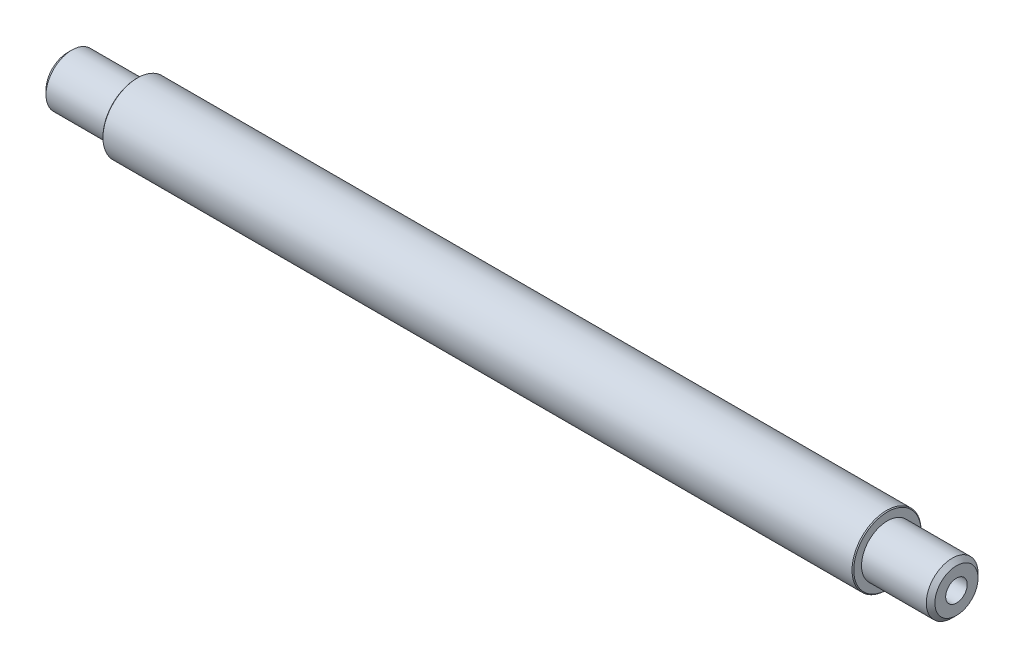
ISO-10303-21;
HEADER;
FILE_DESCRIPTION(('STEP AP214'),'2;1');
FILE_NAME('part.step','',(''),(''),'','','');
FILE_SCHEMA(('AUTOMOTIVE_DESIGN { 1 0 10303 214 1 1 1 1 }'));
ENDSEC;
DATA;
#1=APPLICATION_CONTEXT('core data for automotive mechanical design processes');
#2=APPLICATION_PROTOCOL_DEFINITION('international standard','automotive_design',2000,#1);
#3=PRODUCT_CONTEXT('',#1,'mechanical');
#4=PRODUCT('Part','Part','',(#3));
#5=PRODUCT_RELATED_PRODUCT_CATEGORY('part','',(#4));
#6=PRODUCT_DEFINITION_FORMATION('','',#4);
#7=PRODUCT_DEFINITION_CONTEXT('part definition',#1,'design');
#8=PRODUCT_DEFINITION('design','',#6,#7);
#9=PRODUCT_DEFINITION_SHAPE('','',#8);
#10=(LENGTH_UNIT() NAMED_UNIT(*) SI_UNIT(.MILLI.,.METRE.));
#11=(NAMED_UNIT(*) PLANE_ANGLE_UNIT() SI_UNIT($,.RADIAN.));
#12=(NAMED_UNIT(*) SI_UNIT($,.STERADIAN.) SOLID_ANGLE_UNIT());
#13=UNCERTAINTY_MEASURE_WITH_UNIT(LENGTH_MEASURE(1.E-05),#10,'distance_accuracy_value','');
#14=(GEOMETRIC_REPRESENTATION_CONTEXT(3) GLOBAL_UNCERTAINTY_ASSIGNED_CONTEXT((#13)) GLOBAL_UNIT_ASSIGNED_CONTEXT((#10,
#11,#12)) REPRESENTATION_CONTEXT('',''));
#15=CARTESIAN_POINT('',(0.,0.,0.));
#16=DIRECTION('',(0.,0.,1.));
#17=DIRECTION('',(1.,0.,0.));
#18=AXIS2_PLACEMENT_3D('',#15,#16,#17);
#19=CARTESIAN_POINT('',(-43.5,3.99999999999999,0.));
#20=DIRECTION('',(1.,0.,0.));
#21=DIRECTION('',(0.,0.,-1.));
#22=AXIS2_PLACEMENT_3D('',#19,#20,#21);
#23=PLANE('',#22);
#24=CARTESIAN_POINT('',(-43.5,0.,0.));
#25=DIRECTION('',(1.,0.,0.));
#26=DIRECTION('',(0.,0.,-1.));
#27=AXIS2_PLACEMENT_3D('',#24,#25,#26);
#28=CIRCLE('',#27,3.9);
#29=CARTESIAN_POINT('',(-43.5,0.,-3.9));
#30=VERTEX_POINT('',#29);
#31=EDGE_CURVE('E11',#30,#30,#28,.F.);
#32=ORIENTED_EDGE('',*,*,#31,.T.);
#33=EDGE_LOOP('',(#32));
#34=FACE_BOUND('',#33,.T.);
#35=CARTESIAN_POINT('',(-43.5,0.,0.));
#36=DIRECTION('',(-1.,0.,0.));
#37=DIRECTION('',(0.,0.,1.));
#38=AXIS2_PLACEMENT_3D('',#35,#36,#37);
#39=CIRCLE('',#38,3.);
#40=CARTESIAN_POINT('',(-43.5,0.,3.));
#41=VERTEX_POINT('',#40);
#42=EDGE_CURVE('E81',#41,#41,#39,.T.);
#43=ORIENTED_EDGE('',*,*,#42,.F.);
#44=EDGE_LOOP('',(#43));
#45=FACE_BOUND('',#44,.T.);
#46=ADVANCED_FACE('F45',(#34,#45),#23,.F.);
#47=CARTESIAN_POINT('',(-61.2907002135734,0.,0.));
#48=DIRECTION('',(-1.,0.,0.));
#49=DIRECTION('',(0.,0.,1.));
#50=AXIS2_PLACEMENT_3D('',#47,#48,#49);
#51=CYLINDRICAL_SURFACE('',#50,3.99999999999999);
#52=CARTESIAN_POINT('',(43.4,0.,0.));
#53=DIRECTION('',(-1.,0.,0.));
#54=DIRECTION('',(0.,0.,1.));
#55=AXIS2_PLACEMENT_3D('',#52,#53,#54);
#56=CIRCLE('',#55,3.99999999999999);
#57=CARTESIAN_POINT('',(43.4,0.,3.99999999999999));
#58=VERTEX_POINT('',#57);
#59=EDGE_CURVE('E102',#58,#58,#56,.T.);
#60=ORIENTED_EDGE('',*,*,#59,.T.);
#61=EDGE_LOOP('',(#60));
#62=FACE_BOUND('',#61,.T.);
#63=CARTESIAN_POINT('',(-43.4,0.,0.));
#64=DIRECTION('',(1.,0.,0.));
#65=DIRECTION('',(0.,0.,-1.));
#66=AXIS2_PLACEMENT_3D('',#63,#64,#65);
#67=CIRCLE('',#66,3.99999999999999);
#68=CARTESIAN_POINT('',(-43.4,0.,-3.99999999999999));
#69=VERTEX_POINT('',#68);
#70=EDGE_CURVE('E99',#69,#69,#67,.T.);
#71=ORIENTED_EDGE('',*,*,#70,.T.);
#72=EDGE_LOOP('',(#71));
#73=FACE_BOUND('',#72,.T.);
#74=ADVANCED_FACE('F116',(#62,#73),#51,.T.);
#75=CARTESIAN_POINT('',(43.5,3.99999999999999,0.));
#76=DIRECTION('',(-1.,0.,0.));
#77=DIRECTION('',(0.,0.,1.));
#78=AXIS2_PLACEMENT_3D('',#75,#76,#77);
#79=PLANE('',#78);
#80=CARTESIAN_POINT('',(43.5,0.,0.));
#81=DIRECTION('',(-1.,0.,0.));
#82=DIRECTION('',(0.,0.,1.));
#83=AXIS2_PLACEMENT_3D('',#80,#81,#82);
#84=CIRCLE('',#83,3.90000000000001);
#85=CARTESIAN_POINT('',(43.5,0.,3.9));
#86=VERTEX_POINT('',#85);
#87=EDGE_CURVE('E54',#86,#86,#84,.F.);
#88=ORIENTED_EDGE('',*,*,#87,.T.);
#89=EDGE_LOOP('',(#88));
#90=FACE_BOUND('',#89,.T.);
#91=CARTESIAN_POINT('',(43.5,0.,0.));
#92=DIRECTION('',(-1.,0.,0.));
#93=DIRECTION('',(0.,0.,1.));
#94=AXIS2_PLACEMENT_3D('',#91,#92,#93);
#95=CIRCLE('',#94,3.);
#96=CARTESIAN_POINT('',(43.5,0.,3.));
#97=VERTEX_POINT('',#96);
#98=EDGE_CURVE('E84',#97,#97,#95,.T.);
#99=ORIENTED_EDGE('',*,*,#98,.T.);
#100=EDGE_LOOP('',(#99));
#101=FACE_BOUND('',#100,.T.);
#102=ADVANCED_FACE('F107',(#90,#101),#79,.F.);
#103=CARTESIAN_POINT('',(-61.2907002135734,0.,0.));
#104=DIRECTION('',(-1.,0.,0.));
#105=DIRECTION('',(0.,0.,1.));
#106=AXIS2_PLACEMENT_3D('',#103,#104,#105);
#107=CYLINDRICAL_SURFACE('',#106,3.);
#108=CARTESIAN_POINT('',(51.,0.,0.));
#109=DIRECTION('',(-1.,0.,0.));
#110=DIRECTION('',(0.,0.,1.));
#111=AXIS2_PLACEMENT_3D('',#108,#109,#110);
#112=CIRCLE('',#111,3.);
#113=CARTESIAN_POINT('',(51.,0.,3.));
#114=VERTEX_POINT('',#113);
#115=EDGE_CURVE('E87',#114,#114,#112,.T.);
#116=ORIENTED_EDGE('',*,*,#115,.T.);
#117=EDGE_LOOP('',(#116));
#118=FACE_BOUND('',#117,.T.);
#119=ORIENTED_EDGE('',*,*,#98,.F.);
#120=EDGE_LOOP('',(#119));
#121=FACE_BOUND('',#120,.T.);
#122=ADVANCED_FACE('F152',(#118,#121),#107,.T.);
#123=CARTESIAN_POINT('',(51.5,3.,0.));
#124=DIRECTION('',(-1.,0.,0.));
#125=DIRECTION('',(0.,0.,1.));
#126=AXIS2_PLACEMENT_3D('',#123,#124,#125);
#127=PLANE('',#126);
#128=CARTESIAN_POINT('',(51.5,0.,0.));
#129=DIRECTION('',(1.,0.,0.));
#130=DIRECTION('',(0.,0.,-1.));
#131=AXIS2_PLACEMENT_3D('',#128,#129,#130);
#132=CIRCLE('',#131,1.24999999999999);
#133=CARTESIAN_POINT('',(51.5,0.,-1.24999999999999));
#134=VERTEX_POINT('',#133);
#135=EDGE_CURVE('E70',#134,#134,#132,.T.);
#136=ORIENTED_EDGE('',*,*,#135,.F.);
#137=EDGE_LOOP('',(#136));
#138=FACE_BOUND('',#137,.T.);
#139=CARTESIAN_POINT('',(51.5,0.,0.));
#140=DIRECTION('',(-1.,0.,0.));
#141=DIRECTION('',(0.,0.,1.));
#142=AXIS2_PLACEMENT_3D('',#139,#140,#141);
#143=CIRCLE('',#142,2.49999999999999);
#144=CARTESIAN_POINT('',(51.5,0.,2.49999999999999));
#145=VERTEX_POINT('',#144);
#146=EDGE_CURVE('E90',#145,#145,#143,.F.);
#147=ORIENTED_EDGE('',*,*,#146,.T.);
#148=EDGE_LOOP('',(#147));
#149=FACE_BOUND('',#148,.T.);
#150=ADVANCED_FACE('F144',(#138,#149),#127,.F.);
#151=CARTESIAN_POINT('',(-51.5,3.,0.));
#152=DIRECTION('',(1.,0.,0.));
#153=DIRECTION('',(0.,0.,-1.));
#154=AXIS2_PLACEMENT_3D('',#151,#152,#153);
#155=PLANE('',#154);
#156=CARTESIAN_POINT('',(-51.5,0.,0.));
#157=DIRECTION('',(-1.,0.,0.));
#158=DIRECTION('',(0.,0.,1.));
#159=AXIS2_PLACEMENT_3D('',#156,#157,#158);
#160=CIRCLE('',#159,1.24999999999999);
#161=CARTESIAN_POINT('',(-51.5,0.,1.24999999999999));
#162=VERTEX_POINT('',#161);
#163=EDGE_CURVE('E71',#162,#162,#160,.T.);
#164=ORIENTED_EDGE('',*,*,#163,.F.);
#165=EDGE_LOOP('',(#164));
#166=FACE_BOUND('',#165,.T.);
#167=CARTESIAN_POINT('',(-51.5,0.,0.));
#168=DIRECTION('',(1.,0.,0.));
#169=DIRECTION('',(0.,0.,-1.));
#170=AXIS2_PLACEMENT_3D('',#167,#168,#169);
#171=CIRCLE('',#170,2.5);
#172=CARTESIAN_POINT('',(-51.5,0.,-2.5));
#173=VERTEX_POINT('',#172);
#174=EDGE_CURVE('E93',#173,#173,#171,.F.);
#175=ORIENTED_EDGE('',*,*,#174,.T.);
#176=EDGE_LOOP('',(#175));
#177=FACE_BOUND('',#176,.T.);
#178=ADVANCED_FACE('F135',(#166,#177),#155,.F.);
#179=CARTESIAN_POINT('',(-61.2907002135734,0.,0.));
#180=DIRECTION('',(-1.,0.,0.));
#181=DIRECTION('',(0.,0.,1.));
#182=AXIS2_PLACEMENT_3D('',#179,#180,#181);
#183=CYLINDRICAL_SURFACE('',#182,3.);
#184=CARTESIAN_POINT('',(-51.,0.,0.));
#185=DIRECTION('',(1.,0.,0.));
#186=DIRECTION('',(0.,0.,-1.));
#187=AXIS2_PLACEMENT_3D('',#184,#185,#186);
#188=CIRCLE('',#187,3.);
#189=CARTESIAN_POINT('',(-51.,0.,-3.));
#190=VERTEX_POINT('',#189);
#191=EDGE_CURVE('E96',#190,#190,#188,.T.);
#192=ORIENTED_EDGE('',*,*,#191,.T.);
#193=EDGE_LOOP('',(#192));
#194=FACE_BOUND('',#193,.T.);
#195=ORIENTED_EDGE('',*,*,#42,.T.);
#196=EDGE_LOOP('',(#195));
#197=FACE_BOUND('',#196,.T.);
#198=ADVANCED_FACE('F132',(#194,#197),#183,.T.);
#199=CARTESIAN_POINT('',(51.,0.,0.));
#200=DIRECTION('',(-1.,0.,0.));
#201=DIRECTION('',(0.,0.,1.));
#202=AXIS2_PLACEMENT_3D('',#199,#200,#201);
#203=CONICAL_SURFACE('',#202,3.,0.785398163397473);
#204=ORIENTED_EDGE('',*,*,#146,.F.);
#205=EDGE_LOOP('',(#204));
#206=FACE_BOUND('',#205,.T.);
#207=ORIENTED_EDGE('',*,*,#115,.F.);
#208=EDGE_LOOP('',(#207));
#209=FACE_BOUND('',#208,.T.);
#210=ADVANCED_FACE('F134',(#206,#209),#203,.T.);
#211=CARTESIAN_POINT('',(-51.5,0.,0.));
#212=DIRECTION('',(1.,0.,0.));
#213=DIRECTION('',(0.,0.,-1.));
#214=AXIS2_PLACEMENT_3D('',#211,#212,#213);
#215=CONICAL_SURFACE('',#214,2.5,0.785398163397452);
#216=ORIENTED_EDGE('',*,*,#191,.F.);
#217=EDGE_LOOP('',(#216));
#218=FACE_BOUND('',#217,.T.);
#219=ORIENTED_EDGE('',*,*,#174,.F.);
#220=EDGE_LOOP('',(#219));
#221=FACE_BOUND('',#220,.T.);
#222=ADVANCED_FACE('F113',(#218,#221),#215,.T.);
#223=CARTESIAN_POINT('',(43.4,0.,0.));
#224=DIRECTION('',(-1.,0.,0.));
#225=DIRECTION('',(0.,0.,1.));
#226=AXIS2_PLACEMENT_3D('',#223,#224,#225);
#227=CONICAL_SURFACE('',#226,3.99999999999999,0.785398163397448);
#228=CARTESIAN_POINT('',(43.5,0.,3.9));
#229=CARTESIAN_POINT('',(43.4989583333333,0.,3.90104166666667));
#230=CARTESIAN_POINT('',(43.4979166666667,0.,3.90208333333334));
#231=CARTESIAN_POINT('',(43.4958333333333,0.,3.90416666666667));
#232=CARTESIAN_POINT('',(43.4947916666667,0.,3.90520833333334));
#233=CARTESIAN_POINT('',(43.4927083333333,0.,3.90729166666667));
#234=CARTESIAN_POINT('',(43.4916666666667,0.,3.90833333333334));
#235=CARTESIAN_POINT('',(43.4895833333333,0.,3.91041666666667));
#236=CARTESIAN_POINT('',(43.4885416666667,0.,3.91145833333334));
#237=CARTESIAN_POINT('',(43.4864583333333,0.,3.91354166666667));
#238=CARTESIAN_POINT('',(43.4854166666667,0.,3.91458333333334));
#239=CARTESIAN_POINT('',(43.4833333333333,0.,3.91666666666667));
#240=CARTESIAN_POINT('',(43.4822916666667,0.,3.91770833333333));
#241=CARTESIAN_POINT('',(43.4802083333333,0.,3.91979166666667));
#242=CARTESIAN_POINT('',(43.4791666666667,0.,3.92083333333333));
#243=CARTESIAN_POINT('',(43.4770833333333,0.,3.92291666666667));
#244=CARTESIAN_POINT('',(43.4760416666667,0.,3.92395833333333));
#245=CARTESIAN_POINT('',(43.4739583333333,0.,3.92604166666667));
#246=CARTESIAN_POINT('',(43.4729166666667,0.,3.92708333333333));
#247=CARTESIAN_POINT('',(43.4708333333333,0.,3.92916666666667));
#248=CARTESIAN_POINT('',(43.4697916666667,0.,3.93020833333333));
#249=CARTESIAN_POINT('',(43.4677083333333,0.,3.93229166666666));
#250=CARTESIAN_POINT('',(43.4666666666667,0.,3.93333333333333));
#251=CARTESIAN_POINT('',(43.4645833333333,0.,3.93541666666666));
#252=CARTESIAN_POINT('',(43.4635416666667,0.,3.93645833333333));
#253=CARTESIAN_POINT('',(43.4614583333333,0.,3.93854166666666));
#254=CARTESIAN_POINT('',(43.4604166666667,0.,3.93958333333333));
#255=CARTESIAN_POINT('',(43.4583333333333,0.,3.94166666666666));
#256=CARTESIAN_POINT('',(43.4572916666667,0.,3.94270833333333));
#257=CARTESIAN_POINT('',(43.4552083333333,0.,3.94479166666666));
#258=CARTESIAN_POINT('',(43.4541666666667,0.,3.94583333333333));
#259=CARTESIAN_POINT('',(43.4520833333333,0.,3.94791666666666));
#260=CARTESIAN_POINT('',(43.4510416666667,0.,3.94895833333333));
#261=CARTESIAN_POINT('',(43.4489583333333,0.,3.95104166666666));
#262=CARTESIAN_POINT('',(43.4479166666667,0.,3.95208333333333));
#263=CARTESIAN_POINT('',(43.4458333333333,0.,3.95416666666666));
#264=CARTESIAN_POINT('',(43.4447916666667,0.,3.95520833333333));
#265=CARTESIAN_POINT('',(43.4427083333333,0.,3.95729166666666));
#266=CARTESIAN_POINT('',(43.4416666666667,0.,3.95833333333333));
#267=CARTESIAN_POINT('',(43.4395833333333,0.,3.96041666666666));
#268=CARTESIAN_POINT('',(43.4385416666667,0.,3.96145833333333));
#269=CARTESIAN_POINT('',(43.4364583333333,0.,3.96354166666666));
#270=CARTESIAN_POINT('',(43.4354166666667,0.,3.96458333333333));
#271=CARTESIAN_POINT('',(43.4333333333333,0.,3.96666666666666));
#272=CARTESIAN_POINT('',(43.4322916666667,0.,3.96770833333332));
#273=CARTESIAN_POINT('',(43.4302083333333,0.,3.96979166666666));
#274=CARTESIAN_POINT('',(43.4291666666667,0.,3.97083333333332));
#275=CARTESIAN_POINT('',(43.4270833333333,0.,3.97291666666666));
#276=CARTESIAN_POINT('',(43.4260416666667,0.,3.97395833333332));
#277=CARTESIAN_POINT('',(43.4239583333333,0.,3.97604166666666));
#278=CARTESIAN_POINT('',(43.4229166666667,0.,3.97708333333332));
#279=CARTESIAN_POINT('',(43.4208333333333,0.,3.97916666666666));
#280=CARTESIAN_POINT('',(43.4197916666667,0.,3.98020833333332));
#281=CARTESIAN_POINT('',(43.4177083333333,0.,3.98229166666666));
#282=CARTESIAN_POINT('',(43.4166666666667,0.,3.98333333333332));
#283=CARTESIAN_POINT('',(43.4145833333333,0.,3.98541666666666));
#284=CARTESIAN_POINT('',(43.4135416666667,0.,3.98645833333332));
#285=CARTESIAN_POINT('',(43.4114583333333,0.,3.98854166666665));
#286=CARTESIAN_POINT('',(43.4104166666667,0.,3.98958333333332));
#287=CARTESIAN_POINT('',(43.4083333333333,0.,3.99166666666665));
#288=CARTESIAN_POINT('',(43.4072916666667,0.,3.99270833333332));
#289=CARTESIAN_POINT('',(43.4052083333333,0.,3.99479166666665));
#290=CARTESIAN_POINT('',(43.4041666666667,0.,3.99583333333332));
#291=CARTESIAN_POINT('',(43.4020833333334,0.,3.99791666666665));
#292=CARTESIAN_POINT('',(43.4010416666667,0.,3.99895833333332));
#293=CARTESIAN_POINT('',(43.4,0.,3.99999999999999));
#294=B_SPLINE_CURVE_WITH_KNOTS('',3,(#228,#229,#230,#231,#232,#233,#234,#235,#236,#237,#238,
#239,#240,#241,#242,#243,#244,#245,#246,#247,#248,#249,#250,#251,#252,#253,#254,#255,#256,#257,
#258,#259,#260,#261,#262,#263,#264,#265,#266,#267,#268,#269,#270,#271,#272,#273,#274,#275,#276,
#277,#278,#279,#280,#281,#282,#283,#284,#285,#286,#287,#288,#289,#290,#291,#292,#293),
.UNSPECIFIED.,.F.,.F.,(4,2,2,2,2,2,2,2,2,2,2,2,2,2,2,2,2,2,2,2,2,2,2,2,2,2,2,2,2,2,2,2,4),(0.,
0.00441941738241513,0.00883883476483026,0.0132582521472457,0.0176776695296611,
0.0220970869120766,0.0265165042944914,0.0309359216769068,0.0353553390593223,0.0397747564417377,
0.0441941738241525,0.0486135912065679,0.0530330085889834,0.0574524259713988,0.0618718433538136,
0.0662912607362291,0.0707106781186445,0.07513009550106,0.0795495128834748,0.0839689302658902,
0.0883883476483057,0.0928077650307211,0.0972271824131359,0.101646599795551,0.106066017177967,
0.110485434560382,0.114904851942798,0.119324269325212,0.123743686707628,0.128163104090043,
0.132582521472458,0.137001938854874,0.141421356237289),.UNSPECIFIED.);
#295=EDGE_CURVE('BSEAM110',#86,#58,#294,.T.);
#296=ORIENTED_EDGE('',*,*,#87,.F.);
#297=ORIENTED_EDGE('',*,*,#59,.F.);
#298=ORIENTED_EDGE('',*,*,#295,.T.);
#299=ORIENTED_EDGE('',*,*,#295,.F.);
#300=EDGE_LOOP('',(#296,#298,#297,#299));
#301=FACE_BOUND('',#300,.T.);
#302=ADVANCED_FACE('F110',(#301),#227,.T.);
#303=CARTESIAN_POINT('',(-43.5,0.,0.));
#304=DIRECTION('',(1.,0.,0.));
#305=DIRECTION('',(0.,0.,-1.));
#306=AXIS2_PLACEMENT_3D('',#303,#304,#305);
#307=CONICAL_SURFACE('',#306,3.9,0.785398163397379);
#308=ORIENTED_EDGE('',*,*,#70,.F.);
#309=EDGE_LOOP('',(#308));
#310=FACE_BOUND('',#309,.T.);
#311=ORIENTED_EDGE('',*,*,#31,.F.);
#312=EDGE_LOOP('',(#311));
#313=FACE_BOUND('',#312,.T.);
#314=ADVANCED_FACE('F48',(#310,#313),#307,.T.);
#315=CARTESIAN_POINT('',(43.,0.,0.));
#316=DIRECTION('',(1.,0.,0.));
#317=DIRECTION('',(0.,0.,-1.));
#318=AXIS2_PLACEMENT_3D('',#315,#316,#317);
#319=CONICAL_SURFACE('',#318,1.25,1.02974425867665);
#320=CARTESIAN_POINT('',(42.2489242262155,0.,0.));
#321=VERTEX_POINT('',#320);
#322=VERTEX_LOOP('',#321);
#323=FACE_BOUND('',#322,.T.);
#324=CARTESIAN_POINT('',(43.,0.,0.));
#325=DIRECTION('',(1.,0.,0.));
#326=DIRECTION('',(0.,0.,-1.));
#327=AXIS2_PLACEMENT_3D('',#324,#325,#326);
#328=CIRCLE('',#327,1.25);
#329=CARTESIAN_POINT('',(43.,0.,-1.25));
#330=VERTEX_POINT('',#329);
#331=EDGE_CURVE('E74',#330,#330,#328,.T.);
#332=ORIENTED_EDGE('',*,*,#331,.T.);
#333=EDGE_LOOP('',(#332));
#334=FACE_BOUND('',#333,.T.);
#335=ADVANCED_FACE('F124',(#323,#334),#319,.F.);
#336=CARTESIAN_POINT('',(51.5,0.,0.));
#337=DIRECTION('',(1.,0.,0.));
#338=DIRECTION('',(0.,0.,-1.));
#339=AXIS2_PLACEMENT_3D('',#336,#337,#338);
#340=CYLINDRICAL_SURFACE('',#339,1.24999999999999);
#341=ORIENTED_EDGE('',*,*,#331,.F.);
#342=EDGE_LOOP('',(#341));
#343=FACE_BOUND('',#342,.T.);
#344=ORIENTED_EDGE('',*,*,#135,.T.);
#345=EDGE_LOOP('',(#344));
#346=FACE_BOUND('',#345,.T.);
#347=ADVANCED_FACE('F64',(#343,#346),#340,.F.);
#348=CARTESIAN_POINT('',(-43.,0.,0.));
#349=DIRECTION('',(-1.,0.,0.));
#350=DIRECTION('',(0.,0.,1.));
#351=AXIS2_PLACEMENT_3D('',#348,#349,#350);
#352=CONICAL_SURFACE('',#351,1.25,1.02974425867665);
#353=CARTESIAN_POINT('',(-42.2489242262155,0.,0.));
#354=VERTEX_POINT('',#353);
#355=VERTEX_LOOP('',#354);
#356=FACE_BOUND('',#355,.T.);
#357=CARTESIAN_POINT('',(-43.,0.,0.));
#358=DIRECTION('',(-1.,0.,0.));
#359=DIRECTION('',(0.,0.,1.));
#360=AXIS2_PLACEMENT_3D('',#357,#358,#359);
#361=CIRCLE('',#360,1.25);
#362=CARTESIAN_POINT('',(-43.,0.,1.25));
#363=VERTEX_POINT('',#362);
#364=EDGE_CURVE('E68',#363,#363,#361,.T.);
#365=ORIENTED_EDGE('',*,*,#364,.T.);
#366=EDGE_LOOP('',(#365));
#367=FACE_BOUND('',#366,.T.);
#368=ADVANCED_FACE('F60',(#356,#367),#352,.F.);
#369=CARTESIAN_POINT('',(-51.5,0.,0.));
#370=DIRECTION('',(-1.,0.,0.));
#371=DIRECTION('',(0.,0.,1.));
#372=AXIS2_PLACEMENT_3D('',#369,#370,#371);
#373=CYLINDRICAL_SURFACE('',#372,1.24999999999999);
#374=ORIENTED_EDGE('',*,*,#364,.F.);
#375=EDGE_LOOP('',(#374));
#376=FACE_BOUND('',#375,.T.);
#377=ORIENTED_EDGE('',*,*,#163,.T.);
#378=EDGE_LOOP('',(#377));
#379=FACE_BOUND('',#378,.T.);
#380=ADVANCED_FACE('F63',(#376,#379),#373,.F.);
#381=CLOSED_SHELL('',(#46,#74,#102,#122,#150,#178,#198,#210,#222,#302,#314,#335,#347,#368,#380));
#382=MANIFOLD_SOLID_BREP('B2',#381);
#383=ADVANCED_BREP_SHAPE_REPRESENTATION('',(#18,#382),#14);
#384=SHAPE_DEFINITION_REPRESENTATION(#9,#383);
ENDSEC;
END-ISO-10303-21;
